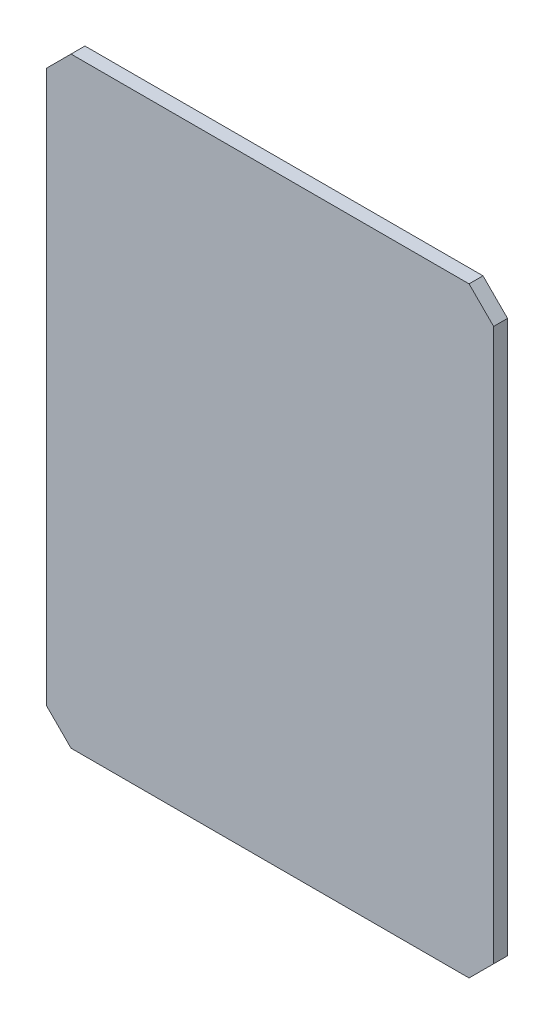
ISO-10303-21;
HEADER;
FILE_DESCRIPTION(('STEP AP214'),'2;1');
FILE_NAME('part.step','',(''),(''),'','','');
FILE_SCHEMA(('AUTOMOTIVE_DESIGN { 1 0 10303 214 1 1 1 1 }'));
ENDSEC;
DATA;
#1=APPLICATION_CONTEXT('core data for automotive mechanical design processes');
#2=APPLICATION_PROTOCOL_DEFINITION('international standard','automotive_design',2000,#1);
#3=PRODUCT_CONTEXT('',#1,'mechanical');
#4=PRODUCT('Part','Part','',(#3));
#5=PRODUCT_RELATED_PRODUCT_CATEGORY('part','',(#4));
#6=PRODUCT_DEFINITION_FORMATION('','',#4);
#7=PRODUCT_DEFINITION_CONTEXT('part definition',#1,'design');
#8=PRODUCT_DEFINITION('design','',#6,#7);
#9=PRODUCT_DEFINITION_SHAPE('','',#8);
#10=(LENGTH_UNIT() NAMED_UNIT(*) SI_UNIT(.MILLI.,.METRE.));
#11=(NAMED_UNIT(*) PLANE_ANGLE_UNIT() SI_UNIT($,.RADIAN.));
#12=(NAMED_UNIT(*) SI_UNIT($,.STERADIAN.) SOLID_ANGLE_UNIT());
#13=UNCERTAINTY_MEASURE_WITH_UNIT(LENGTH_MEASURE(1.E-05),#10,'distance_accuracy_value','');
#14=(GEOMETRIC_REPRESENTATION_CONTEXT(3) GLOBAL_UNCERTAINTY_ASSIGNED_CONTEXT((#13)) GLOBAL_UNIT_ASSIGNED_CONTEXT((#10,
#11,#12)) REPRESENTATION_CONTEXT('',''));
#15=CARTESIAN_POINT('',(0.,0.,0.));
#16=DIRECTION('',(0.,0.,1.));
#17=DIRECTION('',(1.,0.,0.));
#18=AXIS2_PLACEMENT_3D('',#15,#16,#17);
#19=CARTESIAN_POINT('',(-273.,367.,17.));
#20=DIRECTION('',(1.,0.,0.));
#21=DIRECTION('',(0.,1.,0.));
#22=AXIS2_PLACEMENT_3D('',#19,#20,#21);
#23=PLANE('',#22);
#24=DIRECTION('',(0.,-1.,0.));
#25=VECTOR('',#24,1.);
#26=CARTESIAN_POINT('',(-273.,367.,17.));
#27=LINE('',#26,#25);
#28=CARTESIAN_POINT('',(-273.,337.,17.));
#29=VERTEX_POINT('',#28);
#30=CARTESIAN_POINT('',(-273.,-337.,17.));
#31=VERTEX_POINT('',#30);
#32=EDGE_CURVE('E102',#29,#31,#27,.T.);
#33=ORIENTED_EDGE('',*,*,#32,.F.);
#34=DIRECTION('',(0.,0.,-1.));
#35=VECTOR('',#34,1.);
#36=CARTESIAN_POINT('',(-273.,337.,17.));
#37=LINE('',#36,#35);
#38=CARTESIAN_POINT('',(-273.,337.,0.));
#39=VERTEX_POINT('',#38);
#40=EDGE_CURVE('E87',#29,#39,#37,.T.);
#41=ORIENTED_EDGE('',*,*,#40,.T.);
#42=DIRECTION('',(0.,-1.,0.));
#43=VECTOR('',#42,1.);
#44=CARTESIAN_POINT('',(-273.,367.,0.));
#45=LINE('',#44,#43);
#46=CARTESIAN_POINT('',(-273.,-337.,0.));
#47=VERTEX_POINT('',#46);
#48=EDGE_CURVE('E99',#39,#47,#45,.T.);
#49=ORIENTED_EDGE('',*,*,#48,.T.);
#50=DIRECTION('',(0.,0.,1.));
#51=VECTOR('',#50,1.);
#52=CARTESIAN_POINT('',(-273.,-337.,17.));
#53=LINE('',#52,#51);
#54=EDGE_CURVE('E104',#47,#31,#53,.T.);
#55=ORIENTED_EDGE('',*,*,#54,.T.);
#56=EDGE_LOOP('',(#33,#41,#49,#55));
#57=FACE_BOUND('',#56,.T.);
#58=ADVANCED_FACE('F17',(#57),#23,.F.);
#59=CARTESIAN_POINT('',(-273.,-367.,17.));
#60=DIRECTION('',(0.,1.,0.));
#61=DIRECTION('',(0.,0.,1.));
#62=AXIS2_PLACEMENT_3D('',#59,#60,#61);
#63=PLANE('',#62);
#64=DIRECTION('',(1.,0.,0.));
#65=VECTOR('',#64,1.);
#66=CARTESIAN_POINT('',(-273.,-367.,0.));
#67=LINE('',#66,#65);
#68=CARTESIAN_POINT('',(-243.,-367.,0.));
#69=VERTEX_POINT('',#68);
#70=CARTESIAN_POINT('',(243.,-367.,0.));
#71=VERTEX_POINT('',#70);
#72=EDGE_CURVE('E108',#69,#71,#67,.T.);
#73=ORIENTED_EDGE('',*,*,#72,.T.);
#74=DIRECTION('',(0.,0.,1.));
#75=VECTOR('',#74,1.);
#76=CARTESIAN_POINT('',(243.,-367.,17.));
#77=LINE('',#76,#75);
#78=CARTESIAN_POINT('',(243.,-367.,17.));
#79=VERTEX_POINT('',#78);
#80=EDGE_CURVE('E11',#71,#79,#77,.T.);
#81=ORIENTED_EDGE('',*,*,#80,.T.);
#82=DIRECTION('',(1.,0.,0.));
#83=VECTOR('',#82,1.);
#84=CARTESIAN_POINT('',(-273.,-367.,17.));
#85=LINE('',#84,#83);
#86=CARTESIAN_POINT('',(-243.,-367.,17.));
#87=VERTEX_POINT('',#86);
#88=EDGE_CURVE('E144',#87,#79,#85,.T.);
#89=ORIENTED_EDGE('',*,*,#88,.F.);
#90=DIRECTION('',(0.,0.,-1.));
#91=VECTOR('',#90,1.);
#92=CARTESIAN_POINT('',(-243.,-367.,17.));
#93=LINE('',#92,#91);
#94=EDGE_CURVE('E25',#87,#69,#93,.T.);
#95=ORIENTED_EDGE('',*,*,#94,.T.);
#96=EDGE_LOOP('',(#73,#81,#89,#95));
#97=FACE_BOUND('',#96,.T.);
#98=ADVANCED_FACE('F142',(#97),#63,.F.);
#99=CARTESIAN_POINT('',(273.,367.,17.));
#100=DIRECTION('',(-1.,0.,0.));
#101=DIRECTION('',(0.,-1.,0.));
#102=AXIS2_PLACEMENT_3D('',#99,#100,#101);
#103=PLANE('',#102);
#104=DIRECTION('',(0.,1.,0.));
#105=VECTOR('',#104,1.);
#106=CARTESIAN_POINT('',(273.,367.,0.));
#107=LINE('',#106,#105);
#108=CARTESIAN_POINT('',(273.,-337.,0.));
#109=VERTEX_POINT('',#108);
#110=CARTESIAN_POINT('',(273.,337.,0.));
#111=VERTEX_POINT('',#110);
#112=EDGE_CURVE('E111',#109,#111,#107,.T.);
#113=ORIENTED_EDGE('',*,*,#112,.T.);
#114=DIRECTION('',(0.,0.,1.));
#115=VECTOR('',#114,1.);
#116=CARTESIAN_POINT('',(273.,337.,17.));
#117=LINE('',#116,#115);
#118=CARTESIAN_POINT('',(273.,337.,17.));
#119=VERTEX_POINT('',#118);
#120=EDGE_CURVE('E32',#111,#119,#117,.T.);
#121=ORIENTED_EDGE('',*,*,#120,.T.);
#122=DIRECTION('',(0.,1.,0.));
#123=VECTOR('',#122,1.);
#124=CARTESIAN_POINT('',(273.,367.,17.));
#125=LINE('',#124,#123);
#126=CARTESIAN_POINT('',(273.,-337.,17.));
#127=VERTEX_POINT('',#126);
#128=EDGE_CURVE('E152',#127,#119,#125,.T.);
#129=ORIENTED_EDGE('',*,*,#128,.F.);
#130=DIRECTION('',(0.,0.,-1.));
#131=VECTOR('',#130,1.);
#132=CARTESIAN_POINT('',(273.,-337.,17.));
#133=LINE('',#132,#131);
#134=EDGE_CURVE('E135',#127,#109,#133,.T.);
#135=ORIENTED_EDGE('',*,*,#134,.T.);
#136=EDGE_LOOP('',(#113,#121,#129,#135));
#137=FACE_BOUND('',#136,.T.);
#138=ADVANCED_FACE('F151',(#137),#103,.F.);
#139=CARTESIAN_POINT('',(-273.,367.,17.));
#140=DIRECTION('',(0.,-1.,0.));
#141=DIRECTION('',(0.,0.,-1.));
#142=AXIS2_PLACEMENT_3D('',#139,#140,#141);
#143=PLANE('',#142);
#144=DIRECTION('',(-1.,0.,0.));
#145=VECTOR('',#144,1.);
#146=CARTESIAN_POINT('',(-273.,367.,0.));
#147=LINE('',#146,#145);
#148=CARTESIAN_POINT('',(243.,367.,0.));
#149=VERTEX_POINT('',#148);
#150=CARTESIAN_POINT('',(-243.,367.,0.));
#151=VERTEX_POINT('',#150);
#152=EDGE_CURVE('E118',#149,#151,#147,.T.);
#153=ORIENTED_EDGE('',*,*,#152,.T.);
#154=DIRECTION('',(0.,0.,1.));
#155=VECTOR('',#154,1.);
#156=CARTESIAN_POINT('',(-243.,367.,17.));
#157=LINE('',#156,#155);
#158=CARTESIAN_POINT('',(-243.,367.,17.));
#159=VERTEX_POINT('',#158);
#160=EDGE_CURVE('E88',#151,#159,#157,.T.);
#161=ORIENTED_EDGE('',*,*,#160,.T.);
#162=DIRECTION('',(-1.,0.,0.));
#163=VECTOR('',#162,1.);
#164=CARTESIAN_POINT('',(-273.,367.,17.));
#165=LINE('',#164,#163);
#166=CARTESIAN_POINT('',(243.,367.,17.));
#167=VERTEX_POINT('',#166);
#168=EDGE_CURVE('E114',#167,#159,#165,.T.);
#169=ORIENTED_EDGE('',*,*,#168,.F.);
#170=DIRECTION('',(0.,0.,-1.));
#171=VECTOR('',#170,1.);
#172=CARTESIAN_POINT('',(243.,367.,17.));
#173=LINE('',#172,#171);
#174=EDGE_CURVE('E93',#167,#149,#173,.T.);
#175=ORIENTED_EDGE('',*,*,#174,.T.);
#176=EDGE_LOOP('',(#153,#161,#169,#175));
#177=FACE_BOUND('',#176,.T.);
#178=ADVANCED_FACE('F184',(#177),#143,.F.);
#179=CARTESIAN_POINT('',(0.,0.,17.));
#180=DIRECTION('',(0.,0.,1.));
#181=DIRECTION('',(1.,0.,0.));
#182=AXIS2_PLACEMENT_3D('',#179,#180,#181);
#183=PLANE('',#182);
#184=ORIENTED_EDGE('',*,*,#168,.T.);
#185=DIRECTION('',(0.707106781186549,0.707106781186546,0.));
#186=VECTOR('',#185,1.);
#187=CARTESIAN_POINT('',(-305.,305.,17.));
#188=LINE('',#187,#186);
#189=EDGE_CURVE('E133',#159,#29,#188,.F.);
#190=ORIENTED_EDGE('',*,*,#189,.T.);
#191=ORIENTED_EDGE('',*,*,#32,.T.);
#192=DIRECTION('',(-0.707106781186546,0.707106781186549,0.));
#193=VECTOR('',#192,1.);
#194=CARTESIAN_POINT('',(-305.,-305.,17.));
#195=LINE('',#194,#193);
#196=EDGE_CURVE('E128',#31,#87,#195,.F.);
#197=ORIENTED_EDGE('',*,*,#196,.T.);
#198=ORIENTED_EDGE('',*,*,#88,.T.);
#199=DIRECTION('',(-0.707106781186549,-0.707106781186546,0.));
#200=VECTOR('',#199,1.);
#201=CARTESIAN_POINT('',(305.,-305.,17.));
#202=LINE('',#201,#200);
#203=EDGE_CURVE('E39',#79,#127,#202,.F.);
#204=ORIENTED_EDGE('',*,*,#203,.T.);
#205=ORIENTED_EDGE('',*,*,#128,.T.);
#206=DIRECTION('',(0.707106781186546,-0.707106781186549,0.));
#207=VECTOR('',#206,1.);
#208=CARTESIAN_POINT('',(305.,305.,17.));
#209=LINE('',#208,#207);
#210=EDGE_CURVE('E131',#119,#167,#209,.F.);
#211=ORIENTED_EDGE('',*,*,#210,.T.);
#212=EDGE_LOOP('',(#184,#190,#191,#197,#198,#204,#205,#211));
#213=FACE_BOUND('',#212,.T.);
#214=ADVANCED_FACE('F157',(#213),#183,.T.);
#215=CARTESIAN_POINT('',(0.,0.,0.));
#216=DIRECTION('',(0.,0.,1.));
#217=DIRECTION('',(1.,0.,0.));
#218=AXIS2_PLACEMENT_3D('',#215,#216,#217);
#219=PLANE('',#218);
#220=ORIENTED_EDGE('',*,*,#48,.F.);
#221=DIRECTION('',(-0.707106781186549,-0.707106781186546,0.));
#222=VECTOR('',#221,1.);
#223=CARTESIAN_POINT('',(-273.,337.,0.));
#224=LINE('',#223,#222);
#225=EDGE_CURVE('E83',#39,#151,#224,.F.);
#226=ORIENTED_EDGE('',*,*,#225,.T.);
#227=ORIENTED_EDGE('',*,*,#152,.F.);
#228=DIRECTION('',(-0.707106781186546,0.707106781186549,0.));
#229=VECTOR('',#228,1.);
#230=CARTESIAN_POINT('',(243.,367.,0.));
#231=LINE('',#230,#229);
#232=EDGE_CURVE('E94',#149,#111,#231,.F.);
#233=ORIENTED_EDGE('',*,*,#232,.T.);
#234=ORIENTED_EDGE('',*,*,#112,.F.);
#235=DIRECTION('',(0.707106781186549,0.707106781186546,0.));
#236=VECTOR('',#235,1.);
#237=CARTESIAN_POINT('',(273.,-337.,0.));
#238=LINE('',#237,#236);
#239=EDGE_CURVE('E122',#109,#71,#238,.F.);
#240=ORIENTED_EDGE('',*,*,#239,.T.);
#241=ORIENTED_EDGE('',*,*,#72,.F.);
#242=DIRECTION('',(0.707106781186546,-0.707106781186549,0.));
#243=VECTOR('',#242,1.);
#244=CARTESIAN_POINT('',(-243.,-367.,0.));
#245=LINE('',#244,#243);
#246=EDGE_CURVE('E103',#69,#47,#245,.F.);
#247=ORIENTED_EDGE('',*,*,#246,.T.);
#248=EDGE_LOOP('',(#220,#226,#227,#233,#234,#240,#241,#247));
#249=FACE_BOUND('',#248,.T.);
#250=ADVANCED_FACE('F106',(#249),#219,.F.);
#251=CARTESIAN_POINT('',(-273.,337.,17.));
#252=DIRECTION('',(0.707106781186546,-0.707106781186549,0.));
#253=DIRECTION('',(0.,0.,-1.));
#254=AXIS2_PLACEMENT_3D('',#251,#252,#253);
#255=PLANE('',#254);
#256=ORIENTED_EDGE('',*,*,#189,.F.);
#257=ORIENTED_EDGE('',*,*,#160,.F.);
#258=ORIENTED_EDGE('',*,*,#225,.F.);
#259=ORIENTED_EDGE('',*,*,#40,.F.);
#260=EDGE_LOOP('',(#256,#257,#258,#259));
#261=FACE_BOUND('',#260,.T.);
#262=ADVANCED_FACE('F86',(#261),#255,.F.);
#263=CARTESIAN_POINT('',(243.,367.,17.));
#264=DIRECTION('',(-0.707106781186549,-0.707106781186546,0.));
#265=DIRECTION('',(0.,0.,-1.));
#266=AXIS2_PLACEMENT_3D('',#263,#264,#265);
#267=PLANE('',#266);
#268=ORIENTED_EDGE('',*,*,#210,.F.);
#269=ORIENTED_EDGE('',*,*,#120,.F.);
#270=ORIENTED_EDGE('',*,*,#232,.F.);
#271=ORIENTED_EDGE('',*,*,#174,.F.);
#272=EDGE_LOOP('',(#268,#269,#270,#271));
#273=FACE_BOUND('',#272,.T.);
#274=ADVANCED_FACE('F164',(#273),#267,.F.);
#275=CARTESIAN_POINT('',(273.,-337.,17.));
#276=DIRECTION('',(-0.707106781186546,0.707106781186549,0.));
#277=DIRECTION('',(0.,0.,-1.));
#278=AXIS2_PLACEMENT_3D('',#275,#276,#277);
#279=PLANE('',#278);
#280=ORIENTED_EDGE('',*,*,#203,.F.);
#281=ORIENTED_EDGE('',*,*,#80,.F.);
#282=ORIENTED_EDGE('',*,*,#239,.F.);
#283=ORIENTED_EDGE('',*,*,#134,.F.);
#284=EDGE_LOOP('',(#280,#281,#282,#283));
#285=FACE_BOUND('',#284,.T.);
#286=ADVANCED_FACE('F150',(#285),#279,.F.);
#287=CARTESIAN_POINT('',(-243.,-367.,17.));
#288=DIRECTION('',(0.707106781186549,0.707106781186546,0.));
#289=DIRECTION('',(0.,0.,-1.));
#290=AXIS2_PLACEMENT_3D('',#287,#288,#289);
#291=PLANE('',#290);
#292=ORIENTED_EDGE('',*,*,#196,.F.);
#293=ORIENTED_EDGE('',*,*,#54,.F.);
#294=ORIENTED_EDGE('',*,*,#246,.F.);
#295=ORIENTED_EDGE('',*,*,#94,.F.);
#296=EDGE_LOOP('',(#292,#293,#294,#295));
#297=FACE_BOUND('',#296,.T.);
#298=ADVANCED_FACE('F19',(#297),#291,.F.);
#299=CLOSED_SHELL('',(#58,#98,#138,#178,#214,#250,#262,#274,#286,#298));
#300=MANIFOLD_SOLID_BREP('B1',#299);
#301=ADVANCED_BREP_SHAPE_REPRESENTATION('',(#18,#300),#14);
#302=SHAPE_DEFINITION_REPRESENTATION(#9,#301);
ENDSEC;
END-ISO-10303-21;
